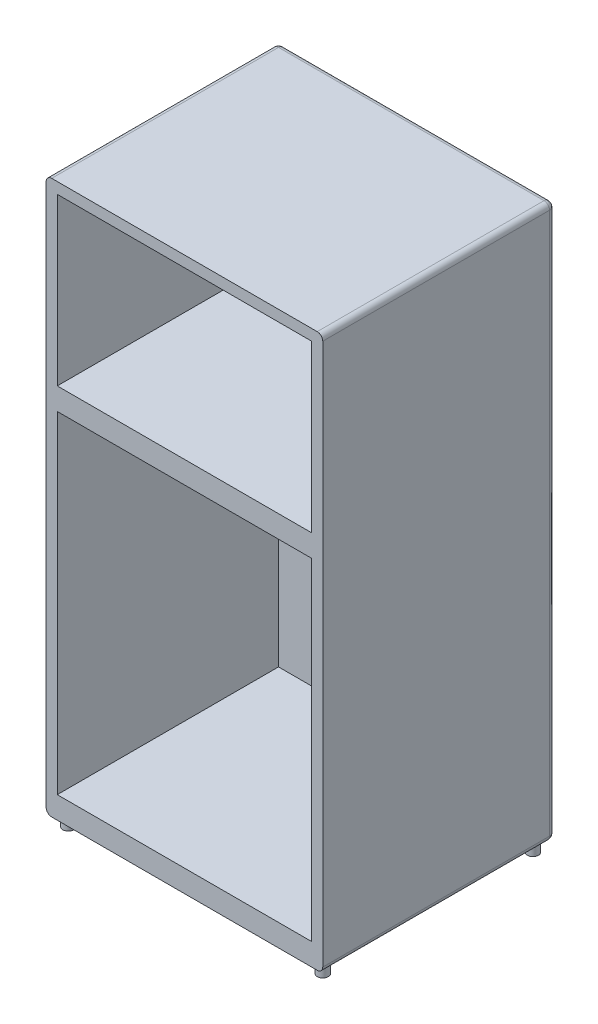
ISO-10303-21;
HEADER;
FILE_DESCRIPTION(('STEP AP214'),'2;1');
FILE_NAME('part.step','',(''),(''),'','','');
FILE_SCHEMA(('AUTOMOTIVE_DESIGN { 1 0 10303 214 1 1 1 1 }'));
ENDSEC;
DATA;
#1=APPLICATION_CONTEXT('core data for automotive mechanical design processes');
#2=APPLICATION_PROTOCOL_DEFINITION('international standard','automotive_design',2000,#1);
#3=PRODUCT_CONTEXT('',#1,'mechanical');
#4=PRODUCT('Part','Part','',(#3));
#5=PRODUCT_RELATED_PRODUCT_CATEGORY('part','',(#4));
#6=PRODUCT_DEFINITION_FORMATION('','',#4);
#7=PRODUCT_DEFINITION_CONTEXT('part definition',#1,'design');
#8=PRODUCT_DEFINITION('design','',#6,#7);
#9=PRODUCT_DEFINITION_SHAPE('','',#8);
#10=(LENGTH_UNIT() NAMED_UNIT(*) SI_UNIT(.MILLI.,.METRE.));
#11=(NAMED_UNIT(*) PLANE_ANGLE_UNIT() SI_UNIT($,.RADIAN.));
#12=(NAMED_UNIT(*) SI_UNIT($,.STERADIAN.) SOLID_ANGLE_UNIT());
#13=UNCERTAINTY_MEASURE_WITH_UNIT(LENGTH_MEASURE(1.E-05),#10,'distance_accuracy_value','');
#14=(GEOMETRIC_REPRESENTATION_CONTEXT(3) GLOBAL_UNCERTAINTY_ASSIGNED_CONTEXT((#13)) GLOBAL_UNIT_ASSIGNED_CONTEXT((#10,
#11,#12)) REPRESENTATION_CONTEXT('',''));
#15=CARTESIAN_POINT('',(0.,0.,0.));
#16=DIRECTION('',(0.,0.,1.));
#17=DIRECTION('',(1.,0.,0.));
#18=AXIS2_PLACEMENT_3D('',#15,#16,#17);
#19=CARTESIAN_POINT('',(-12.5,-25.,21.));
#20=DIRECTION('',(0.,1.,0.));
#21=DIRECTION('',(0.,0.,1.));
#22=AXIS2_PLACEMENT_3D('',#19,#20,#21);
#23=PLANE('',#22);
#24=CARTESIAN_POINT('',(11.5,-25.,20.));
#25=DIRECTION('',(0.,1.,0.));
#26=DIRECTION('',(0.,0.,1.));
#27=AXIS2_PLACEMENT_3D('',#24,#25,#26);
#28=CIRCLE('',#27,0.500000000000001);
#29=CARTESIAN_POINT('',(12.,-25.,20.));
#30=VERTEX_POINT('',#29);
#31=EDGE_CURVE('E269',#30,#30,#28,.F.);
#32=ORIENTED_EDGE('',*,*,#31,.F.);
#33=DIRECTION('',(0.,0.,-1.));
#34=VECTOR('',#33,1.);
#35=CARTESIAN_POINT('',(12.,-25.,21.));
#36=LINE('',#35,#34);
#37=CARTESIAN_POINT('',(12.,-25.,21.));
#38=VERTEX_POINT('',#37);
#39=EDGE_CURVE('E318',#30,#38,#36,.F.);
#40=ORIENTED_EDGE('',*,*,#39,.T.);
#41=DIRECTION('',(1.,0.,0.));
#42=VECTOR('',#41,1.);
#43=CARTESIAN_POINT('',(-12.5,-25.,21.));
#44=LINE('',#43,#42);
#45=CARTESIAN_POINT('',(-12.,-25.,21.));
#46=VERTEX_POINT('',#45);
#47=EDGE_CURVE('E263',#46,#38,#44,.T.);
#48=ORIENTED_EDGE('',*,*,#47,.F.);
#49=DIRECTION('',(0.,0.,-1.));
#50=VECTOR('',#49,1.);
#51=CARTESIAN_POINT('',(-12.,-25.,21.));
#52=LINE('',#51,#50);
#53=CARTESIAN_POINT('',(-12.,-25.,20.));
#54=VERTEX_POINT('',#53);
#55=EDGE_CURVE('E306',#46,#54,#52,.T.);
#56=ORIENTED_EDGE('',*,*,#55,.T.);
#57=CARTESIAN_POINT('',(-11.5,-25.,20.));
#58=DIRECTION('',(0.,1.,0.));
#59=DIRECTION('',(0.,0.,1.));
#60=AXIS2_PLACEMENT_3D('',#57,#58,#59);
#61=CIRCLE('',#60,0.500000000000001);
#62=EDGE_CURVE('E266',#54,#54,#61,.F.);
#63=ORIENTED_EDGE('',*,*,#62,.F.);
#64=DIRECTION('',(0.,0.,-1.));
#65=VECTOR('',#64,1.);
#66=CARTESIAN_POINT('',(-12.,-25.,21.));
#67=LINE('',#66,#65);
#68=CARTESIAN_POINT('',(-12.,-25.,1.));
#69=VERTEX_POINT('',#68);
#70=EDGE_CURVE('E304',#54,#69,#67,.T.);
#71=ORIENTED_EDGE('',*,*,#70,.T.);
#72=CARTESIAN_POINT('',(-11.5,-25.,1.));
#73=DIRECTION('',(0.,1.,0.));
#74=DIRECTION('',(0.,0.,1.));
#75=AXIS2_PLACEMENT_3D('',#72,#73,#74);
#76=CIRCLE('',#75,0.500000000000001);
#77=CARTESIAN_POINT('',(-11.5,-25.,0.500000000000001));
#78=VERTEX_POINT('',#77);
#79=EDGE_CURVE('E276',#78,#69,#76,.F.);
#80=ORIENTED_EDGE('',*,*,#79,.F.);
#81=DIRECTION('',(1.,0.,0.));
#82=VECTOR('',#81,1.);
#83=CARTESIAN_POINT('',(-12.5,-25.,0.5));
#84=LINE('',#83,#82);
#85=CARTESIAN_POINT('',(11.5,-25.,0.500000000000001));
#86=VERTEX_POINT('',#85);
#87=EDGE_CURVE('E310',#78,#86,#84,.T.);
#88=ORIENTED_EDGE('',*,*,#87,.T.);
#89=CARTESIAN_POINT('',(11.5,-25.,1.));
#90=DIRECTION('',(0.,1.,0.));
#91=DIRECTION('',(0.,0.,1.));
#92=AXIS2_PLACEMENT_3D('',#89,#90,#91);
#93=CIRCLE('',#92,0.500000000000001);
#94=CARTESIAN_POINT('',(12.,-25.,1.));
#95=VERTEX_POINT('',#94);
#96=EDGE_CURVE('E272',#95,#86,#93,.F.);
#97=ORIENTED_EDGE('',*,*,#96,.F.);
#98=DIRECTION('',(0.,0.,-1.));
#99=VECTOR('',#98,1.);
#100=CARTESIAN_POINT('',(12.,-25.,21.));
#101=LINE('',#100,#99);
#102=EDGE_CURVE('E316',#95,#30,#101,.F.);
#103=ORIENTED_EDGE('',*,*,#102,.T.);
#104=EDGE_LOOP('',(#32,#40,#48,#56,#63,#71,#80,#88,#97,#103));
#105=FACE_BOUND('',#104,.T.);
#106=ADVANCED_FACE('F33',(#105),#23,.F.);
#107=DIRECTION('',(1.,0.,0.));
#108=VECTOR('',#107,1.);
#109=CARTESIAN_POINT('',(-12.5,-25.,0.5));
#110=LINE('',#109,#108);
#111=CARTESIAN_POINT('',(12.,-25.,0.5));
#112=VERTEX_POINT('',#111);
#113=EDGE_CURVE('E312',#86,#112,#110,.T.);
#114=ORIENTED_EDGE('',*,*,#113,.T.);
#115=DIRECTION('',(0.,0.,-1.));
#116=VECTOR('',#115,1.);
#117=CARTESIAN_POINT('',(12.,-25.,21.));
#118=LINE('',#117,#116);
#119=EDGE_CURVE('E314',#112,#95,#118,.F.);
#120=ORIENTED_EDGE('',*,*,#119,.T.);
#121=EDGE_CURVE('E273',#86,#95,#93,.F.);
#122=ORIENTED_EDGE('',*,*,#121,.F.);
#123=EDGE_LOOP('',(#114,#120,#122));
#124=FACE_BOUND('',#123,.T.);
#125=ADVANCED_FACE('F415',(#124),#23,.F.);
#126=CARTESIAN_POINT('',(12.5,25.,21.));
#127=DIRECTION('',(-1.,0.,0.));
#128=DIRECTION('',(0.,-1.,0.));
#129=AXIS2_PLACEMENT_3D('',#126,#127,#128);
#130=PLANE('',#129);
#131=DIRECTION('',(0.,1.,0.));
#132=VECTOR('',#131,1.);
#133=CARTESIAN_POINT('',(12.5,25.,21.));
#134=LINE('',#133,#132);
#135=CARTESIAN_POINT('',(12.5,-24.5,21.));
#136=VERTEX_POINT('',#135);
#137=CARTESIAN_POINT('',(12.5,24.5,21.));
#138=VERTEX_POINT('',#137);
#139=EDGE_CURVE('E220',#136,#138,#134,.T.);
#140=ORIENTED_EDGE('',*,*,#139,.F.);
#141=DIRECTION('',(0.,0.,-1.));
#142=VECTOR('',#141,1.);
#143=CARTESIAN_POINT('',(12.5,-24.5,21.));
#144=LINE('',#143,#142);
#145=CARTESIAN_POINT('',(12.5,-24.5,0.5));
#146=VERTEX_POINT('',#145);
#147=EDGE_CURVE('E50',#136,#146,#144,.T.);
#148=ORIENTED_EDGE('',*,*,#147,.T.);
#149=DIRECTION('',(0.,1.,0.));
#150=VECTOR('',#149,1.);
#151=CARTESIAN_POINT('',(12.5,25.,0.5));
#152=LINE('',#151,#150);
#153=CARTESIAN_POINT('',(12.5,24.5,0.5));
#154=VERTEX_POINT('',#153);
#155=EDGE_CURVE('E55',#146,#154,#152,.T.);
#156=ORIENTED_EDGE('',*,*,#155,.T.);
#157=DIRECTION('',(0.,0.,-1.));
#158=VECTOR('',#157,1.);
#159=CARTESIAN_POINT('',(12.5,24.5,21.));
#160=LINE('',#159,#158);
#161=EDGE_CURVE('E320',#154,#138,#160,.F.);
#162=ORIENTED_EDGE('',*,*,#161,.T.);
#163=EDGE_LOOP('',(#140,#148,#156,#162));
#164=FACE_BOUND('',#163,.T.);
#165=ADVANCED_FACE('F444',(#164),#130,.F.);
#166=CARTESIAN_POINT('',(-12.5,25.,21.));
#167=DIRECTION('',(0.,-1.,0.));
#168=DIRECTION('',(0.,0.,-1.));
#169=AXIS2_PLACEMENT_3D('',#166,#167,#168);
#170=PLANE('',#169);
#171=DIRECTION('',(-1.,0.,0.));
#172=VECTOR('',#171,1.);
#173=CARTESIAN_POINT('',(-12.5,25.,21.));
#174=LINE('',#173,#172);
#175=CARTESIAN_POINT('',(12.,25.,21.));
#176=VERTEX_POINT('',#175);
#177=CARTESIAN_POINT('',(-12.,25.,21.));
#178=VERTEX_POINT('',#177);
#179=EDGE_CURVE('E257',#176,#178,#174,.T.);
#180=ORIENTED_EDGE('',*,*,#179,.F.);
#181=DIRECTION('',(0.,0.,-1.));
#182=VECTOR('',#181,1.);
#183=CARTESIAN_POINT('',(12.,25.,21.));
#184=LINE('',#183,#182);
#185=CARTESIAN_POINT('',(12.,25.,0.5));
#186=VERTEX_POINT('',#185);
#187=EDGE_CURVE('E285',#176,#186,#184,.T.);
#188=ORIENTED_EDGE('',*,*,#187,.T.);
#189=DIRECTION('',(-1.,0.,0.));
#190=VECTOR('',#189,1.);
#191=CARTESIAN_POINT('',(-12.5,25.,0.5));
#192=LINE('',#191,#190);
#193=CARTESIAN_POINT('',(-12.,25.,0.5));
#194=VERTEX_POINT('',#193);
#195=EDGE_CURVE('E282',#186,#194,#192,.T.);
#196=ORIENTED_EDGE('',*,*,#195,.T.);
#197=DIRECTION('',(0.,0.,-1.));
#198=VECTOR('',#197,1.);
#199=CARTESIAN_POINT('',(-12.,25.,21.));
#200=LINE('',#199,#198);
#201=EDGE_CURVE('E280',#194,#178,#200,.F.);
#202=ORIENTED_EDGE('',*,*,#201,.T.);
#203=EDGE_LOOP('',(#180,#188,#196,#202));
#204=FACE_BOUND('',#203,.T.);
#205=ADVANCED_FACE('F456',(#204),#170,.F.);
#206=CARTESIAN_POINT('',(-12.5,25.,21.));
#207=DIRECTION('',(1.,0.,0.));
#208=DIRECTION('',(0.,1.,0.));
#209=AXIS2_PLACEMENT_3D('',#206,#207,#208);
#210=PLANE('',#209);
#211=DIRECTION('',(0.,-1.,0.));
#212=VECTOR('',#211,1.);
#213=CARTESIAN_POINT('',(-12.5,25.,0.5));
#214=LINE('',#213,#212);
#215=CARTESIAN_POINT('',(-12.5,24.5,0.5));
#216=VERTEX_POINT('',#215);
#217=CARTESIAN_POINT('',(-12.5,-24.5,0.5));
#218=VERTEX_POINT('',#217);
#219=EDGE_CURVE('E298',#216,#218,#214,.T.);
#220=ORIENTED_EDGE('',*,*,#219,.T.);
#221=DIRECTION('',(0.,0.,-1.));
#222=VECTOR('',#221,1.);
#223=CARTESIAN_POINT('',(-12.5,-24.5,21.));
#224=LINE('',#223,#222);
#225=CARTESIAN_POINT('',(-12.5,-24.5,21.));
#226=VERTEX_POINT('',#225);
#227=EDGE_CURVE('E300',#218,#226,#224,.F.);
#228=ORIENTED_EDGE('',*,*,#227,.T.);
#229=DIRECTION('',(0.,-1.,0.));
#230=VECTOR('',#229,1.);
#231=CARTESIAN_POINT('',(-12.5,25.,21.));
#232=LINE('',#231,#230);
#233=CARTESIAN_POINT('',(-12.5,24.5,21.));
#234=VERTEX_POINT('',#233);
#235=EDGE_CURVE('E260',#234,#226,#232,.T.);
#236=ORIENTED_EDGE('',*,*,#235,.F.);
#237=DIRECTION('',(0.,0.,-1.));
#238=VECTOR('',#237,1.);
#239=CARTESIAN_POINT('',(-12.5,24.5,21.));
#240=LINE('',#239,#238);
#241=EDGE_CURVE('E296',#234,#216,#240,.T.);
#242=ORIENTED_EDGE('',*,*,#241,.T.);
#243=EDGE_LOOP('',(#220,#228,#236,#242));
#244=FACE_BOUND('',#243,.T.);
#245=ADVANCED_FACE('F449',(#244),#210,.F.);
#246=DIRECTION('',(0.,0.,-1.));
#247=VECTOR('',#246,1.);
#248=CARTESIAN_POINT('',(-12.,-25.,21.));
#249=LINE('',#248,#247);
#250=CARTESIAN_POINT('',(-12.,-25.,0.5));
#251=VERTEX_POINT('',#250);
#252=EDGE_CURVE('E302',#69,#251,#249,.T.);
#253=ORIENTED_EDGE('',*,*,#252,.T.);
#254=DIRECTION('',(1.,0.,0.));
#255=VECTOR('',#254,1.);
#256=CARTESIAN_POINT('',(-12.5,-25.,0.5));
#257=LINE('',#256,#255);
#258=EDGE_CURVE('E308',#251,#78,#257,.T.);
#259=ORIENTED_EDGE('',*,*,#258,.T.);
#260=EDGE_CURVE('E277',#69,#78,#76,.F.);
#261=ORIENTED_EDGE('',*,*,#260,.F.);
#262=EDGE_LOOP('',(#253,#259,#261));
#263=FACE_BOUND('',#262,.T.);
#264=ADVANCED_FACE('F400',(#263),#23,.F.);
#265=CARTESIAN_POINT('',(0.,0.,21.));
#266=DIRECTION('',(0.,0.,1.));
#267=DIRECTION('',(1.,0.,0.));
#268=AXIS2_PLACEMENT_3D('',#265,#266,#267);
#269=PLANE('',#268);
#270=DIRECTION('',(0.,1.,0.));
#271=VECTOR('',#270,1.);
#272=CARTESIAN_POINT('',(11.5,24.,21.));
#273=LINE('',#272,#271);
#274=CARTESIAN_POINT('',(11.5,9.,21.));
#275=VERTEX_POINT('',#274);
#276=CARTESIAN_POINT('',(11.5,24.,21.));
#277=VERTEX_POINT('',#276);
#278=EDGE_CURVE('E184',#275,#277,#273,.T.);
#279=ORIENTED_EDGE('',*,*,#278,.F.);
#280=DIRECTION('',(1.,0.,0.));
#281=VECTOR('',#280,1.);
#282=CARTESIAN_POINT('',(-11.5,9.,21.));
#283=LINE('',#282,#281);
#284=CARTESIAN_POINT('',(-11.5,9.,21.));
#285=VERTEX_POINT('',#284);
#286=EDGE_CURVE('E201',#285,#275,#283,.T.);
#287=ORIENTED_EDGE('',*,*,#286,.F.);
#288=DIRECTION('',(0.,-1.,0.));
#289=VECTOR('',#288,1.);
#290=CARTESIAN_POINT('',(-11.5,24.,21.));
#291=LINE('',#290,#289);
#292=CARTESIAN_POINT('',(-11.5,24.,21.));
#293=VERTEX_POINT('',#292);
#294=EDGE_CURVE('E204',#293,#285,#291,.T.);
#295=ORIENTED_EDGE('',*,*,#294,.F.);
#296=DIRECTION('',(-1.,0.,0.));
#297=VECTOR('',#296,1.);
#298=CARTESIAN_POINT('',(-11.5,24.,21.));
#299=LINE('',#298,#297);
#300=EDGE_CURVE('E213',#277,#293,#299,.T.);
#301=ORIENTED_EDGE('',*,*,#300,.F.);
#302=EDGE_LOOP('',(#279,#287,#295,#301));
#303=FACE_BOUND('',#302,.T.);
#304=DIRECTION('',(0.,1.,0.));
#305=VECTOR('',#304,1.);
#306=CARTESIAN_POINT('',(11.5,7.,21.));
#307=LINE('',#306,#305);
#308=CARTESIAN_POINT('',(11.5,-23.,21.));
#309=VERTEX_POINT('',#308);
#310=CARTESIAN_POINT('',(11.5,7.,21.));
#311=VERTEX_POINT('',#310);
#312=EDGE_CURVE('E238',#309,#311,#307,.T.);
#313=ORIENTED_EDGE('',*,*,#312,.F.);
#314=DIRECTION('',(1.,0.,0.));
#315=VECTOR('',#314,1.);
#316=CARTESIAN_POINT('',(-11.5,-23.,21.));
#317=LINE('',#316,#315);
#318=CARTESIAN_POINT('',(-11.5,-23.,21.));
#319=VERTEX_POINT('',#318);
#320=EDGE_CURVE('E228',#319,#309,#317,.T.);
#321=ORIENTED_EDGE('',*,*,#320,.F.);
#322=DIRECTION('',(0.,-1.,0.));
#323=VECTOR('',#322,1.);
#324=CARTESIAN_POINT('',(-11.5,7.,21.));
#325=LINE('',#324,#323);
#326=CARTESIAN_POINT('',(-11.5,7.,21.));
#327=VERTEX_POINT('',#326);
#328=EDGE_CURVE('E243',#327,#319,#325,.T.);
#329=ORIENTED_EDGE('',*,*,#328,.F.);
#330=DIRECTION('',(-1.,0.,0.));
#331=VECTOR('',#330,1.);
#332=CARTESIAN_POINT('',(-11.5,7.,21.));
#333=LINE('',#332,#331);
#334=EDGE_CURVE('E240',#311,#327,#333,.T.);
#335=ORIENTED_EDGE('',*,*,#334,.F.);
#336=EDGE_LOOP('',(#313,#321,#329,#335));
#337=FACE_BOUND('',#336,.T.);
#338=ORIENTED_EDGE('',*,*,#47,.T.);
#339=CARTESIAN_POINT('',(12.,-24.5,21.));
#340=DIRECTION('',(0.,0.,1.));
#341=DIRECTION('',(1.,0.,0.));
#342=AXIS2_PLACEMENT_3D('',#339,#340,#341);
#343=CIRCLE('',#342,0.5);
#344=EDGE_CURVE('E11',#38,#136,#343,.T.);
#345=ORIENTED_EDGE('',*,*,#344,.T.);
#346=ORIENTED_EDGE('',*,*,#139,.T.);
#347=CARTESIAN_POINT('',(12.,24.5,21.));
#348=DIRECTION('',(0.,0.,1.));
#349=DIRECTION('',(1.,0.,0.));
#350=AXIS2_PLACEMENT_3D('',#347,#348,#349);
#351=CIRCLE('',#350,0.5);
#352=EDGE_CURVE('E326',#138,#176,#351,.T.);
#353=ORIENTED_EDGE('',*,*,#352,.T.);
#354=ORIENTED_EDGE('',*,*,#179,.T.);
#355=CARTESIAN_POINT('',(-12.,24.5,21.));
#356=DIRECTION('',(0.,0.,1.));
#357=DIRECTION('',(1.,0.,0.));
#358=AXIS2_PLACEMENT_3D('',#355,#356,#357);
#359=CIRCLE('',#358,0.5);
#360=EDGE_CURVE('E324',#178,#234,#359,.T.);
#361=ORIENTED_EDGE('',*,*,#360,.T.);
#362=ORIENTED_EDGE('',*,*,#235,.T.);
#363=CARTESIAN_POINT('',(-12.,-24.5,21.));
#364=DIRECTION('',(0.,0.,1.));
#365=DIRECTION('',(1.,0.,0.));
#366=AXIS2_PLACEMENT_3D('',#363,#364,#365);
#367=CIRCLE('',#366,0.5);
#368=EDGE_CURVE('E42',#226,#46,#367,.T.);
#369=ORIENTED_EDGE('',*,*,#368,.T.);
#370=EDGE_LOOP('',(#338,#345,#346,#353,#354,#361,#362,#369));
#371=FACE_BOUND('',#370,.T.);
#372=ADVANCED_FACE('F448',(#303,#337,#371),#269,.T.);
#373=CARTESIAN_POINT('',(0.,0.,0.));
#374=DIRECTION('',(0.,0.,1.));
#375=DIRECTION('',(1.,0.,0.));
#376=AXIS2_PLACEMENT_3D('',#373,#374,#375);
#377=PLANE('',#376);
#378=DIRECTION('',(0.,-1.,0.));
#379=VECTOR('',#378,1.);
#380=CARTESIAN_POINT('',(-12.,0.,0.));
#381=LINE('',#380,#379);
#382=CARTESIAN_POINT('',(-12.,-24.5,0.));
#383=VERTEX_POINT('',#382);
#384=CARTESIAN_POINT('',(-12.,24.5,0.));
#385=VERTEX_POINT('',#384);
#386=EDGE_CURVE('E291',#383,#385,#381,.F.);
#387=ORIENTED_EDGE('',*,*,#386,.T.);
#388=DIRECTION('',(-1.,0.,0.));
#389=VECTOR('',#388,1.);
#390=CARTESIAN_POINT('',(0.,24.5,0.));
#391=LINE('',#390,#389);
#392=CARTESIAN_POINT('',(12.,24.5,0.));
#393=VERTEX_POINT('',#392);
#394=EDGE_CURVE('E293',#385,#393,#391,.F.);
#395=ORIENTED_EDGE('',*,*,#394,.T.);
#396=DIRECTION('',(0.,1.,0.));
#397=VECTOR('',#396,1.);
#398=CARTESIAN_POINT('',(12.,0.,0.));
#399=LINE('',#398,#397);
#400=CARTESIAN_POINT('',(12.,-24.5,0.));
#401=VERTEX_POINT('',#400);
#402=EDGE_CURVE('E287',#393,#401,#399,.F.);
#403=ORIENTED_EDGE('',*,*,#402,.T.);
#404=DIRECTION('',(1.,0.,0.));
#405=VECTOR('',#404,1.);
#406=CARTESIAN_POINT('',(0.,-24.5,0.));
#407=LINE('',#406,#405);
#408=EDGE_CURVE('E289',#401,#383,#407,.F.);
#409=ORIENTED_EDGE('',*,*,#408,.T.);
#410=EDGE_LOOP('',(#387,#395,#403,#409));
#411=FACE_BOUND('',#410,.T.);
#412=ADVANCED_FACE('F420',(#411),#377,.F.);
#413=CARTESIAN_POINT('',(11.5,7.,1.));
#414=DIRECTION('',(1.,0.,0.));
#415=DIRECTION('',(0.,1.,0.));
#416=AXIS2_PLACEMENT_3D('',#413,#414,#415);
#417=PLANE('',#416);
#418=ORIENTED_EDGE('',*,*,#312,.T.);
#419=DIRECTION('',(0.,0.,1.));
#420=VECTOR('',#419,1.);
#421=CARTESIAN_POINT('',(11.5,7.,1.));
#422=LINE('',#421,#420);
#423=CARTESIAN_POINT('',(11.5,7.,1.));
#424=VERTEX_POINT('',#423);
#425=EDGE_CURVE('E237',#424,#311,#422,.T.);
#426=ORIENTED_EDGE('',*,*,#425,.F.);
#427=DIRECTION('',(0.,1.,0.));
#428=VECTOR('',#427,1.);
#429=CARTESIAN_POINT('',(11.5,7.,1.));
#430=LINE('',#429,#428);
#431=CARTESIAN_POINT('',(11.5,-23.,1.));
#432=VERTEX_POINT('',#431);
#433=EDGE_CURVE('E224',#432,#424,#430,.T.);
#434=ORIENTED_EDGE('',*,*,#433,.F.);
#435=DIRECTION('',(0.,0.,1.));
#436=VECTOR('',#435,1.);
#437=CARTESIAN_POINT('',(11.5,-23.,1.));
#438=LINE('',#437,#436);
#439=EDGE_CURVE('E214',#432,#309,#438,.T.);
#440=ORIENTED_EDGE('',*,*,#439,.T.);
#441=EDGE_LOOP('',(#418,#426,#434,#440));
#442=FACE_BOUND('',#441,.T.);
#443=ADVANCED_FACE('F707',(#442),#417,.F.);
#444=CARTESIAN_POINT('',(-11.5,-23.,1.));
#445=DIRECTION('',(0.,-1.,0.));
#446=DIRECTION('',(0.,0.,-1.));
#447=AXIS2_PLACEMENT_3D('',#444,#445,#446);
#448=PLANE('',#447);
#449=ORIENTED_EDGE('',*,*,#320,.T.);
#450=ORIENTED_EDGE('',*,*,#439,.F.);
#451=DIRECTION('',(1.,0.,0.));
#452=VECTOR('',#451,1.);
#453=CARTESIAN_POINT('',(-11.5,-23.,1.));
#454=LINE('',#453,#452);
#455=CARTESIAN_POINT('',(-11.5,-23.,1.));
#456=VERTEX_POINT('',#455);
#457=EDGE_CURVE('E234',#456,#432,#454,.T.);
#458=ORIENTED_EDGE('',*,*,#457,.F.);
#459=DIRECTION('',(0.,0.,1.));
#460=VECTOR('',#459,1.);
#461=CARTESIAN_POINT('',(-11.5,-23.,1.));
#462=LINE('',#461,#460);
#463=EDGE_CURVE('E249',#456,#319,#462,.T.);
#464=ORIENTED_EDGE('',*,*,#463,.T.);
#465=EDGE_LOOP('',(#449,#450,#458,#464));
#466=FACE_BOUND('',#465,.T.);
#467=ADVANCED_FACE('F698',(#466),#448,.F.);
#468=CARTESIAN_POINT('',(-11.5,7.,1.));
#469=DIRECTION('',(-1.,0.,0.));
#470=DIRECTION('',(0.,-1.,0.));
#471=AXIS2_PLACEMENT_3D('',#468,#469,#470);
#472=PLANE('',#471);
#473=ORIENTED_EDGE('',*,*,#328,.T.);
#474=ORIENTED_EDGE('',*,*,#463,.F.);
#475=DIRECTION('',(0.,-1.,0.));
#476=VECTOR('',#475,1.);
#477=CARTESIAN_POINT('',(-11.5,7.,1.));
#478=LINE('',#477,#476);
#479=CARTESIAN_POINT('',(-11.5,7.,1.));
#480=VERTEX_POINT('',#479);
#481=EDGE_CURVE('E231',#480,#456,#478,.T.);
#482=ORIENTED_EDGE('',*,*,#481,.F.);
#483=DIRECTION('',(0.,0.,1.));
#484=VECTOR('',#483,1.);
#485=CARTESIAN_POINT('',(-11.5,7.,1.));
#486=LINE('',#485,#484);
#487=EDGE_CURVE('E251',#480,#327,#486,.T.);
#488=ORIENTED_EDGE('',*,*,#487,.T.);
#489=EDGE_LOOP('',(#473,#474,#482,#488));
#490=FACE_BOUND('',#489,.T.);
#491=ADVANCED_FACE('F689',(#490),#472,.F.);
#492=CARTESIAN_POINT('',(-11.5,7.,1.));
#493=DIRECTION('',(0.,1.,0.));
#494=DIRECTION('',(0.,0.,1.));
#495=AXIS2_PLACEMENT_3D('',#492,#493,#494);
#496=PLANE('',#495);
#497=ORIENTED_EDGE('',*,*,#334,.T.);
#498=ORIENTED_EDGE('',*,*,#487,.F.);
#499=DIRECTION('',(-1.,0.,0.));
#500=VECTOR('',#499,1.);
#501=CARTESIAN_POINT('',(-11.5,7.,1.));
#502=LINE('',#501,#500);
#503=EDGE_CURVE('E227',#424,#480,#502,.T.);
#504=ORIENTED_EDGE('',*,*,#503,.F.);
#505=ORIENTED_EDGE('',*,*,#425,.T.);
#506=EDGE_LOOP('',(#497,#498,#504,#505));
#507=FACE_BOUND('',#506,.T.);
#508=ADVANCED_FACE('F680',(#507),#496,.F.);
#509=CARTESIAN_POINT('',(0.,0.,1.));
#510=DIRECTION('',(0.,0.,1.));
#511=DIRECTION('',(1.,0.,0.));
#512=AXIS2_PLACEMENT_3D('',#509,#510,#511);
#513=PLANE('',#512);
#514=ORIENTED_EDGE('',*,*,#433,.T.);
#515=ORIENTED_EDGE('',*,*,#503,.T.);
#516=ORIENTED_EDGE('',*,*,#481,.T.);
#517=ORIENTED_EDGE('',*,*,#457,.T.);
#518=EDGE_LOOP('',(#514,#515,#516,#517));
#519=FACE_BOUND('',#518,.T.);
#520=ADVANCED_FACE('F672',(#519),#513,.T.);
#521=CARTESIAN_POINT('',(11.5,24.,1.));
#522=DIRECTION('',(1.,0.,0.));
#523=DIRECTION('',(0.,0.,-1.));
#524=AXIS2_PLACEMENT_3D('',#521,#522,#523);
#525=PLANE('',#524);
#526=ORIENTED_EDGE('',*,*,#278,.T.);
#527=DIRECTION('',(0.,0.,1.));
#528=VECTOR('',#527,1.);
#529=CARTESIAN_POINT('',(11.5,24.,1.));
#530=LINE('',#529,#528);
#531=CARTESIAN_POINT('',(11.5,24.,1.));
#532=VERTEX_POINT('',#531);
#533=EDGE_CURVE('E177',#532,#277,#530,.T.);
#534=ORIENTED_EDGE('',*,*,#533,.F.);
#535=DIRECTION('',(0.,1.,0.));
#536=VECTOR('',#535,1.);
#537=CARTESIAN_POINT('',(11.5,24.,1.));
#538=LINE('',#537,#536);
#539=CARTESIAN_POINT('',(11.5,9.,1.));
#540=VERTEX_POINT('',#539);
#541=EDGE_CURVE('E181',#540,#532,#538,.T.);
#542=ORIENTED_EDGE('',*,*,#541,.F.);
#543=DIRECTION('',(0.,0.,1.));
#544=VECTOR('',#543,1.);
#545=CARTESIAN_POINT('',(11.5,9.,1.));
#546=LINE('',#545,#544);
#547=EDGE_CURVE('E218',#540,#275,#546,.T.);
#548=ORIENTED_EDGE('',*,*,#547,.T.);
#549=EDGE_LOOP('',(#526,#534,#542,#548));
#550=FACE_BOUND('',#549,.T.);
#551=ADVANCED_FACE('F179',(#550),#525,.F.);
#552=CARTESIAN_POINT('',(-11.5,9.,1.));
#553=DIRECTION('',(0.,-1.,0.));
#554=DIRECTION('',(0.,0.,-1.));
#555=AXIS2_PLACEMENT_3D('',#552,#553,#554);
#556=PLANE('',#555);
#557=ORIENTED_EDGE('',*,*,#286,.T.);
#558=ORIENTED_EDGE('',*,*,#547,.F.);
#559=DIRECTION('',(1.,0.,0.));
#560=VECTOR('',#559,1.);
#561=CARTESIAN_POINT('',(-11.5,9.,1.));
#562=LINE('',#561,#560);
#563=CARTESIAN_POINT('',(-11.5,9.,1.));
#564=VERTEX_POINT('',#563);
#565=EDGE_CURVE('E189',#564,#540,#562,.T.);
#566=ORIENTED_EDGE('',*,*,#565,.F.);
#567=DIRECTION('',(0.,0.,1.));
#568=VECTOR('',#567,1.);
#569=CARTESIAN_POINT('',(-11.5,9.,1.));
#570=LINE('',#569,#568);
#571=EDGE_CURVE('E221',#564,#285,#570,.T.);
#572=ORIENTED_EDGE('',*,*,#571,.T.);
#573=EDGE_LOOP('',(#557,#558,#566,#572));
#574=FACE_BOUND('',#573,.T.);
#575=ADVANCED_FACE('F655',(#574),#556,.F.);
#576=CARTESIAN_POINT('',(-11.5,24.,1.));
#577=DIRECTION('',(-1.,0.,0.));
#578=DIRECTION('',(0.,-1.,0.));
#579=AXIS2_PLACEMENT_3D('',#576,#577,#578);
#580=PLANE('',#579);
#581=ORIENTED_EDGE('',*,*,#294,.T.);
#582=ORIENTED_EDGE('',*,*,#571,.F.);
#583=DIRECTION('',(0.,-1.,0.));
#584=VECTOR('',#583,1.);
#585=CARTESIAN_POINT('',(-11.5,24.,1.));
#586=LINE('',#585,#584);
#587=CARTESIAN_POINT('',(-11.5,24.,1.));
#588=VERTEX_POINT('',#587);
#589=EDGE_CURVE('E197',#588,#564,#586,.T.);
#590=ORIENTED_EDGE('',*,*,#589,.F.);
#591=DIRECTION('',(0.,0.,1.));
#592=VECTOR('',#591,1.);
#593=CARTESIAN_POINT('',(-11.5,24.,1.));
#594=LINE('',#593,#592);
#595=EDGE_CURVE('E188',#588,#293,#594,.T.);
#596=ORIENTED_EDGE('',*,*,#595,.T.);
#597=EDGE_LOOP('',(#581,#582,#590,#596));
#598=FACE_BOUND('',#597,.T.);
#599=ADVANCED_FACE('F647',(#598),#580,.F.);
#600=CARTESIAN_POINT('',(-11.5,24.,1.));
#601=DIRECTION('',(0.,1.,0.));
#602=DIRECTION('',(0.,0.,1.));
#603=AXIS2_PLACEMENT_3D('',#600,#601,#602);
#604=PLANE('',#603);
#605=ORIENTED_EDGE('',*,*,#300,.T.);
#606=ORIENTED_EDGE('',*,*,#595,.F.);
#607=DIRECTION('',(-1.,0.,0.));
#608=VECTOR('',#607,1.);
#609=CARTESIAN_POINT('',(-11.5,24.,1.));
#610=LINE('',#609,#608);
#611=EDGE_CURVE('E192',#532,#588,#610,.T.);
#612=ORIENTED_EDGE('',*,*,#611,.F.);
#613=ORIENTED_EDGE('',*,*,#533,.T.);
#614=EDGE_LOOP('',(#605,#606,#612,#613));
#615=FACE_BOUND('',#614,.T.);
#616=ADVANCED_FACE('F193',(#615),#604,.F.);
#617=CARTESIAN_POINT('',(0.,0.,1.));
#618=DIRECTION('',(0.,0.,1.));
#619=DIRECTION('',(1.,0.,0.));
#620=AXIS2_PLACEMENT_3D('',#617,#618,#619);
#621=PLANE('',#620);
#622=ORIENTED_EDGE('',*,*,#541,.T.);
#623=ORIENTED_EDGE('',*,*,#611,.T.);
#624=ORIENTED_EDGE('',*,*,#589,.T.);
#625=ORIENTED_EDGE('',*,*,#565,.T.);
#626=EDGE_LOOP('',(#622,#623,#624,#625));
#627=FACE_BOUND('',#626,.T.);
#628=ADVANCED_FACE('F199',(#627),#621,.T.);
#629=CARTESIAN_POINT('',(-11.5,-26.,20.));
#630=DIRECTION('',(0.,1.,0.));
#631=DIRECTION('',(0.,0.,1.));
#632=AXIS2_PLACEMENT_3D('',#629,#630,#631);
#633=CYLINDRICAL_SURFACE('',#632,0.500000000000001);
#634=CARTESIAN_POINT('',(-11.5,-26.,20.));
#635=DIRECTION('',(0.,-1.,0.));
#636=DIRECTION('',(0.,0.,-1.));
#637=AXIS2_PLACEMENT_3D('',#634,#635,#636);
#638=CIRCLE('',#637,0.500000000000001);
#639=CARTESIAN_POINT('',(-11.5,-26.,19.5));
#640=VERTEX_POINT('',#639);
#641=EDGE_CURVE('E207',#640,#640,#638,.T.);
#642=ORIENTED_EDGE('',*,*,#641,.F.);
#643=EDGE_LOOP('',(#642));
#644=FACE_BOUND('',#643,.T.);
#645=ORIENTED_EDGE('',*,*,#62,.T.);
#646=EDGE_LOOP('',(#645));
#647=FACE_BOUND('',#646,.T.);
#648=ADVANCED_FACE('F379',(#644,#647),#633,.T.);
#649=CARTESIAN_POINT('',(-11.5,-26.,20.));
#650=DIRECTION('',(0.,-1.,0.));
#651=DIRECTION('',(0.,0.,-1.));
#652=AXIS2_PLACEMENT_3D('',#649,#650,#651);
#653=PLANE('',#652);
#654=ORIENTED_EDGE('',*,*,#641,.T.);
#655=EDGE_LOOP('',(#654));
#656=FACE_BOUND('',#655,.T.);
#657=ADVANCED_FACE('F377',(#656),#653,.T.);
#658=CARTESIAN_POINT('',(11.5,-26.,20.));
#659=DIRECTION('',(0.,1.,0.));
#660=DIRECTION('',(0.,0.,1.));
#661=AXIS2_PLACEMENT_3D('',#658,#659,#660);
#662=CYLINDRICAL_SURFACE('',#661,0.500000000000001);
#663=CARTESIAN_POINT('',(11.5,-26.,20.));
#664=DIRECTION('',(0.,-1.,0.));
#665=DIRECTION('',(0.,0.,-1.));
#666=AXIS2_PLACEMENT_3D('',#663,#664,#665);
#667=CIRCLE('',#666,0.500000000000001);
#668=CARTESIAN_POINT('',(11.5,-26.,19.5));
#669=VERTEX_POINT('',#668);
#670=EDGE_CURVE('E369',#669,#669,#667,.T.);
#671=ORIENTED_EDGE('',*,*,#670,.F.);
#672=EDGE_LOOP('',(#671));
#673=FACE_BOUND('',#672,.T.);
#674=ORIENTED_EDGE('',*,*,#31,.T.);
#675=EDGE_LOOP('',(#674));
#676=FACE_BOUND('',#675,.T.);
#677=ADVANCED_FACE('F612',(#673,#676),#662,.T.);
#678=CARTESIAN_POINT('',(11.5,-26.,20.));
#679=DIRECTION('',(0.,-1.,0.));
#680=DIRECTION('',(0.,0.,-1.));
#681=AXIS2_PLACEMENT_3D('',#678,#679,#680);
#682=PLANE('',#681);
#683=ORIENTED_EDGE('',*,*,#670,.T.);
#684=EDGE_LOOP('',(#683));
#685=FACE_BOUND('',#684,.T.);
#686=ADVANCED_FACE('F603',(#685),#682,.T.);
#687=CARTESIAN_POINT('',(11.5,-26.,1.));
#688=DIRECTION('',(0.,1.,0.));
#689=DIRECTION('',(0.,0.,1.));
#690=AXIS2_PLACEMENT_3D('',#687,#688,#689);
#691=CYLINDRICAL_SURFACE('',#690,0.500000000000001);
#692=CARTESIAN_POINT('',(11.5,-26.,1.));
#693=DIRECTION('',(0.,-1.,0.));
#694=DIRECTION('',(0.,0.,-1.));
#695=AXIS2_PLACEMENT_3D('',#692,#693,#694);
#696=CIRCLE('',#695,0.500000000000001);
#697=CARTESIAN_POINT('',(11.5,-26.,0.499999999999999));
#698=VERTEX_POINT('',#697);
#699=EDGE_CURVE('E364',#698,#698,#696,.T.);
#700=ORIENTED_EDGE('',*,*,#699,.F.);
#701=EDGE_LOOP('',(#700));
#702=FACE_BOUND('',#701,.T.);
#703=ORIENTED_EDGE('',*,*,#121,.T.);
#704=ORIENTED_EDGE('',*,*,#96,.T.);
#705=EDGE_LOOP('',(#703,#704));
#706=FACE_BOUND('',#705,.T.);
#707=ADVANCED_FACE('F412',(#702,#706),#691,.T.);
#708=CARTESIAN_POINT('',(11.5,-26.,1.));
#709=DIRECTION('',(0.,-1.,0.));
#710=DIRECTION('',(0.,0.,-1.));
#711=AXIS2_PLACEMENT_3D('',#708,#709,#710);
#712=PLANE('',#711);
#713=ORIENTED_EDGE('',*,*,#699,.T.);
#714=EDGE_LOOP('',(#713));
#715=FACE_BOUND('',#714,.T.);
#716=ADVANCED_FACE('F586',(#715),#712,.T.);
#717=CARTESIAN_POINT('',(-11.5,-26.,1.));
#718=DIRECTION('',(0.,1.,0.));
#719=DIRECTION('',(0.,0.,1.));
#720=AXIS2_PLACEMENT_3D('',#717,#718,#719);
#721=CYLINDRICAL_SURFACE('',#720,0.500000000000001);
#722=CARTESIAN_POINT('',(-11.5,-26.,1.));
#723=DIRECTION('',(0.,-1.,0.));
#724=DIRECTION('',(0.,0.,-1.));
#725=AXIS2_PLACEMENT_3D('',#722,#723,#724);
#726=CIRCLE('',#725,0.500000000000001);
#727=CARTESIAN_POINT('',(-11.5,-26.,0.499999999999999));
#728=VERTEX_POINT('',#727);
#729=EDGE_CURVE('E361',#728,#728,#726,.T.);
#730=ORIENTED_EDGE('',*,*,#729,.F.);
#731=EDGE_LOOP('',(#730));
#732=FACE_BOUND('',#731,.T.);
#733=ORIENTED_EDGE('',*,*,#260,.T.);
#734=ORIENTED_EDGE('',*,*,#79,.T.);
#735=EDGE_LOOP('',(#733,#734));
#736=FACE_BOUND('',#735,.T.);
#737=ADVANCED_FACE('F578',(#732,#736),#721,.T.);
#738=CARTESIAN_POINT('',(-11.5,-26.,1.));
#739=DIRECTION('',(0.,-1.,0.));
#740=DIRECTION('',(0.,0.,-1.));
#741=AXIS2_PLACEMENT_3D('',#738,#739,#740);
#742=PLANE('',#741);
#743=ORIENTED_EDGE('',*,*,#729,.T.);
#744=EDGE_LOOP('',(#743));
#745=FACE_BOUND('',#744,.T.);
#746=ADVANCED_FACE('F560',(#745),#742,.T.);
#747=CARTESIAN_POINT('',(12.,-24.5,21.));
#748=DIRECTION('',(0.,0.,-1.));
#749=DIRECTION('',(-1.,0.,0.));
#750=AXIS2_PLACEMENT_3D('',#747,#748,#749);
#751=CYLINDRICAL_SURFACE('',#750,0.5);
#752=ORIENTED_EDGE('',*,*,#102,.F.);
#753=ORIENTED_EDGE('',*,*,#119,.F.);
#754=CARTESIAN_POINT('',(12.,-24.5,0.5));
#755=DIRECTION('',(0.,0.,-1.));
#756=DIRECTION('',(-1.,0.,0.));
#757=AXIS2_PLACEMENT_3D('',#754,#755,#756);
#758=CIRCLE('',#757,0.5);
#759=EDGE_CURVE('E356',#146,#112,#758,.T.);
#760=ORIENTED_EDGE('',*,*,#759,.F.);
#761=ORIENTED_EDGE('',*,*,#147,.F.);
#762=ORIENTED_EDGE('',*,*,#344,.F.);
#763=ORIENTED_EDGE('',*,*,#39,.F.);
#764=EDGE_LOOP('',(#752,#753,#760,#761,#762,#763));
#765=FACE_BOUND('',#764,.T.);
#766=ADVANCED_FACE('F35',(#765),#751,.T.);
#767=CARTESIAN_POINT('',(-12.,-24.5,21.));
#768=DIRECTION('',(0.,0.,-1.));
#769=DIRECTION('',(-1.,0.,0.));
#770=AXIS2_PLACEMENT_3D('',#767,#768,#769);
#771=CYLINDRICAL_SURFACE('',#770,0.5);
#772=ORIENTED_EDGE('',*,*,#368,.F.);
#773=ORIENTED_EDGE('',*,*,#227,.F.);
#774=CARTESIAN_POINT('',(-12.,-24.5,0.5));
#775=DIRECTION('',(0.,0.,-1.));
#776=DIRECTION('',(-1.,0.,0.));
#777=AXIS2_PLACEMENT_3D('',#774,#775,#776);
#778=CIRCLE('',#777,0.5);
#779=EDGE_CURVE('E354',#251,#218,#778,.T.);
#780=ORIENTED_EDGE('',*,*,#779,.F.);
#781=ORIENTED_EDGE('',*,*,#252,.F.);
#782=ORIENTED_EDGE('',*,*,#70,.F.);
#783=ORIENTED_EDGE('',*,*,#55,.F.);
#784=EDGE_LOOP('',(#772,#773,#780,#781,#782,#783));
#785=FACE_BOUND('',#784,.T.);
#786=ADVANCED_FACE('F394',(#785),#771,.T.);
#787=CARTESIAN_POINT('',(-12.5,-24.5,0.5));
#788=DIRECTION('',(1.,0.,0.));
#789=DIRECTION('',(0.,0.,-1.));
#790=AXIS2_PLACEMENT_3D('',#787,#788,#789);
#791=CYLINDRICAL_SURFACE('',#790,0.5);
#792=CARTESIAN_POINT('',(12.,-24.5,0.5));
#793=DIRECTION('',(1.,0.,0.));
#794=DIRECTION('',(0.,0.,-1.));
#795=AXIS2_PLACEMENT_3D('',#792,#793,#794);
#796=CIRCLE('',#795,0.5);
#797=EDGE_CURVE('E37',#112,#401,#796,.T.);
#798=ORIENTED_EDGE('',*,*,#797,.F.);
#799=ORIENTED_EDGE('',*,*,#113,.F.);
#800=ORIENTED_EDGE('',*,*,#87,.F.);
#801=ORIENTED_EDGE('',*,*,#258,.F.);
#802=CARTESIAN_POINT('',(-12.,-24.5,0.5));
#803=DIRECTION('',(-1.,0.,0.));
#804=DIRECTION('',(0.,0.,1.));
#805=AXIS2_PLACEMENT_3D('',#802,#803,#804);
#806=CIRCLE('',#805,0.5);
#807=EDGE_CURVE('E351',#383,#251,#806,.T.);
#808=ORIENTED_EDGE('',*,*,#807,.F.);
#809=ORIENTED_EDGE('',*,*,#408,.F.);
#810=EDGE_LOOP('',(#798,#799,#800,#801,#808,#809));
#811=FACE_BOUND('',#810,.T.);
#812=ADVANCED_FACE('F404',(#811),#791,.T.);
#813=CARTESIAN_POINT('',(12.,-24.5,0.5));
#814=DIRECTION('',(0.,0.,1.));
#815=DIRECTION('',(1.,0.,0.));
#816=AXIS2_PLACEMENT_3D('',#813,#814,#815);
#817=SPHERICAL_SURFACE('',#816,0.5);
#818=ORIENTED_EDGE('',*,*,#759,.T.);
#819=ORIENTED_EDGE('',*,*,#797,.T.);
#820=CARTESIAN_POINT('',(12.,-24.5,0.5));
#821=DIRECTION('',(0.,-1.,0.));
#822=DIRECTION('',(0.,0.,-1.));
#823=AXIS2_PLACEMENT_3D('',#820,#821,#822);
#824=CIRCLE('',#823,0.5);
#825=EDGE_CURVE('E348',#146,#401,#824,.F.);
#826=ORIENTED_EDGE('',*,*,#825,.F.);
#827=EDGE_LOOP('',(#818,#819,#826));
#828=FACE_BOUND('',#827,.T.);
#829=ADVANCED_FACE('F428',(#828),#817,.T.);
#830=CARTESIAN_POINT('',(-12.,-24.5,0.5));
#831=DIRECTION('',(0.,0.,1.));
#832=DIRECTION('',(1.,0.,0.));
#833=AXIS2_PLACEMENT_3D('',#830,#831,#832);
#834=SPHERICAL_SURFACE('',#833,0.5);
#835=ORIENTED_EDGE('',*,*,#807,.T.);
#836=ORIENTED_EDGE('',*,*,#779,.T.);
#837=CARTESIAN_POINT('',(-12.,-24.5,0.5));
#838=DIRECTION('',(0.,-1.,0.));
#839=DIRECTION('',(0.,0.,-1.));
#840=AXIS2_PLACEMENT_3D('',#837,#838,#839);
#841=CIRCLE('',#840,0.5);
#842=EDGE_CURVE('E345',#383,#218,#841,.F.);
#843=ORIENTED_EDGE('',*,*,#842,.F.);
#844=EDGE_LOOP('',(#835,#836,#843));
#845=FACE_BOUND('',#844,.T.);
#846=ADVANCED_FACE('F430',(#845),#834,.T.);
#847=CARTESIAN_POINT('',(12.,25.,0.5));
#848=DIRECTION('',(0.,1.,0.));
#849=DIRECTION('',(-1.,0.,0.));
#850=AXIS2_PLACEMENT_3D('',#847,#848,#849);
#851=CYLINDRICAL_SURFACE('',#850,0.5);
#852=ORIENTED_EDGE('',*,*,#825,.T.);
#853=ORIENTED_EDGE('',*,*,#402,.F.);
#854=CARTESIAN_POINT('',(12.,24.5,0.5));
#855=DIRECTION('',(0.,1.,0.));
#856=DIRECTION('',(0.,0.,1.));
#857=AXIS2_PLACEMENT_3D('',#854,#855,#856);
#858=CIRCLE('',#857,0.5);
#859=EDGE_CURVE('E342',#154,#393,#858,.T.);
#860=ORIENTED_EDGE('',*,*,#859,.F.);
#861=ORIENTED_EDGE('',*,*,#155,.F.);
#862=EDGE_LOOP('',(#852,#853,#860,#861));
#863=FACE_BOUND('',#862,.T.);
#864=ADVANCED_FACE('F427',(#863),#851,.T.);
#865=CARTESIAN_POINT('',(12.,24.5,21.));
#866=DIRECTION('',(0.,0.,-1.));
#867=DIRECTION('',(-1.,0.,0.));
#868=AXIS2_PLACEMENT_3D('',#865,#866,#867);
#869=CYLINDRICAL_SURFACE('',#868,0.5);
#870=ORIENTED_EDGE('',*,*,#352,.F.);
#871=ORIENTED_EDGE('',*,*,#161,.F.);
#872=CARTESIAN_POINT('',(12.,24.5,0.5));
#873=DIRECTION('',(0.,0.,-1.));
#874=DIRECTION('',(-1.,0.,0.));
#875=AXIS2_PLACEMENT_3D('',#872,#873,#874);
#876=CIRCLE('',#875,0.5);
#877=EDGE_CURVE('E339',#186,#154,#876,.T.);
#878=ORIENTED_EDGE('',*,*,#877,.F.);
#879=ORIENTED_EDGE('',*,*,#187,.F.);
#880=EDGE_LOOP('',(#870,#871,#878,#879));
#881=FACE_BOUND('',#880,.T.);
#882=ADVANCED_FACE('F485',(#881),#869,.T.);
#883=CARTESIAN_POINT('',(-12.,24.5,21.));
#884=DIRECTION('',(0.,0.,-1.));
#885=DIRECTION('',(-1.,0.,0.));
#886=AXIS2_PLACEMENT_3D('',#883,#884,#885);
#887=CYLINDRICAL_SURFACE('',#886,0.5);
#888=ORIENTED_EDGE('',*,*,#360,.F.);
#889=ORIENTED_EDGE('',*,*,#201,.F.);
#890=CARTESIAN_POINT('',(-12.,24.5,0.5));
#891=DIRECTION('',(0.,0.,-1.));
#892=DIRECTION('',(-1.,0.,0.));
#893=AXIS2_PLACEMENT_3D('',#890,#891,#892);
#894=CIRCLE('',#893,0.5);
#895=EDGE_CURVE('E336',#216,#194,#894,.T.);
#896=ORIENTED_EDGE('',*,*,#895,.F.);
#897=ORIENTED_EDGE('',*,*,#241,.F.);
#898=EDGE_LOOP('',(#888,#889,#896,#897));
#899=FACE_BOUND('',#898,.T.);
#900=ADVANCED_FACE('F481',(#899),#887,.T.);
#901=CARTESIAN_POINT('',(-12.,25.,0.5));
#902=DIRECTION('',(0.,-1.,0.));
#903=DIRECTION('',(1.,0.,0.));
#904=AXIS2_PLACEMENT_3D('',#901,#902,#903);
#905=CYLINDRICAL_SURFACE('',#904,0.5);
#906=ORIENTED_EDGE('',*,*,#842,.T.);
#907=ORIENTED_EDGE('',*,*,#219,.F.);
#908=CARTESIAN_POINT('',(-12.,24.5,0.5));
#909=DIRECTION('',(0.,1.,0.));
#910=DIRECTION('',(0.,0.,1.));
#911=AXIS2_PLACEMENT_3D('',#908,#909,#910);
#912=CIRCLE('',#911,0.5);
#913=EDGE_CURVE('E333',#385,#216,#912,.T.);
#914=ORIENTED_EDGE('',*,*,#913,.F.);
#915=ORIENTED_EDGE('',*,*,#386,.F.);
#916=EDGE_LOOP('',(#906,#907,#914,#915));
#917=FACE_BOUND('',#916,.T.);
#918=ADVANCED_FACE('F477',(#917),#905,.T.);
#919=CARTESIAN_POINT('',(12.,24.5,0.5));
#920=DIRECTION('',(0.,0.,1.));
#921=DIRECTION('',(1.,0.,0.));
#922=AXIS2_PLACEMENT_3D('',#919,#920,#921);
#923=SPHERICAL_SURFACE('',#922,0.5);
#924=ORIENTED_EDGE('',*,*,#877,.T.);
#925=ORIENTED_EDGE('',*,*,#859,.T.);
#926=CARTESIAN_POINT('',(12.,24.5,0.5));
#927=DIRECTION('',(1.,0.,0.));
#928=DIRECTION('',(0.,0.,-1.));
#929=AXIS2_PLACEMENT_3D('',#926,#927,#928);
#930=CIRCLE('',#929,0.5);
#931=EDGE_CURVE('E331',#186,#393,#930,.F.);
#932=ORIENTED_EDGE('',*,*,#931,.F.);
#933=EDGE_LOOP('',(#924,#925,#932));
#934=FACE_BOUND('',#933,.T.);
#935=ADVANCED_FACE('F473',(#934),#923,.T.);
#936=CARTESIAN_POINT('',(-12.,24.5,0.5));
#937=DIRECTION('',(0.,0.,1.));
#938=DIRECTION('',(1.,0.,0.));
#939=AXIS2_PLACEMENT_3D('',#936,#937,#938);
#940=SPHERICAL_SURFACE('',#939,0.5);
#941=ORIENTED_EDGE('',*,*,#913,.T.);
#942=ORIENTED_EDGE('',*,*,#895,.T.);
#943=CARTESIAN_POINT('',(-12.,24.5,0.5));
#944=DIRECTION('',(-1.,0.,0.));
#945=DIRECTION('',(0.,0.,1.));
#946=AXIS2_PLACEMENT_3D('',#943,#944,#945);
#947=CIRCLE('',#946,0.5);
#948=EDGE_CURVE('E329',#385,#194,#947,.F.);
#949=ORIENTED_EDGE('',*,*,#948,.F.);
#950=EDGE_LOOP('',(#941,#942,#949));
#951=FACE_BOUND('',#950,.T.);
#952=ADVANCED_FACE('F469',(#951),#940,.T.);
#953=CARTESIAN_POINT('',(-12.5,24.5,0.5));
#954=DIRECTION('',(-1.,0.,0.));
#955=DIRECTION('',(0.,0.,1.));
#956=AXIS2_PLACEMENT_3D('',#953,#954,#955);
#957=CYLINDRICAL_SURFACE('',#956,0.5);
#958=ORIENTED_EDGE('',*,*,#931,.T.);
#959=ORIENTED_EDGE('',*,*,#394,.F.);
#960=ORIENTED_EDGE('',*,*,#948,.T.);
#961=ORIENTED_EDGE('',*,*,#195,.F.);
#962=EDGE_LOOP('',(#958,#959,#960,#961));
#963=FACE_BOUND('',#962,.T.);
#964=ADVANCED_FACE('F466',(#963),#957,.T.);
#965=CLOSED_SHELL('',(#106,#125,#165,#205,#245,#264,#372,#412,#443,#467,#491,#508,#520,#551,
#575,#599,#616,#628,#648,#657,#677,#686,#707,#716,#737,#746,#766,#786,#812,#829,#846,#864,#882,
#900,#918,#935,#952,#964));
#966=MANIFOLD_SOLID_BREP('B2',#965);
#967=ADVANCED_BREP_SHAPE_REPRESENTATION('',(#18,#966),#14);
#968=SHAPE_DEFINITION_REPRESENTATION(#9,#967);
ENDSEC;
END-ISO-10303-21;
